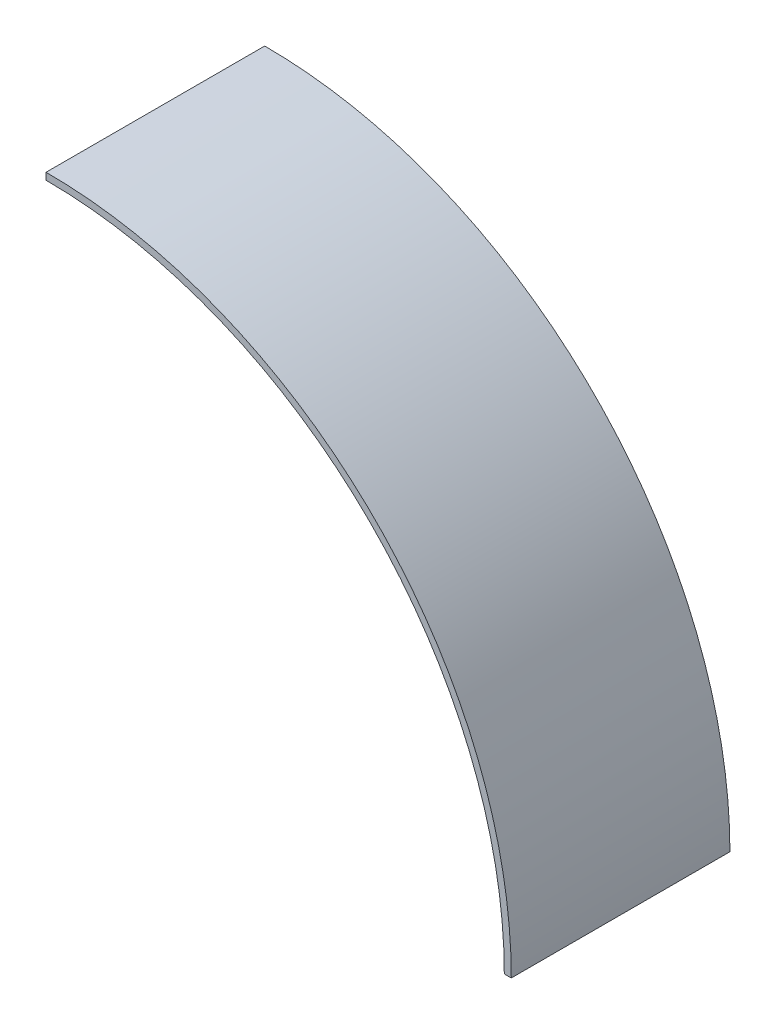
ISO-10303-21;
HEADER;
FILE_DESCRIPTION(('STEP AP214'),'2;1');
FILE_NAME('part.step','',(''),(''),'','','');
FILE_SCHEMA(('AUTOMOTIVE_DESIGN { 1 0 10303 214 1 1 1 1 }'));
ENDSEC;
DATA;
#1=APPLICATION_CONTEXT('core data for automotive mechanical design processes');
#2=APPLICATION_PROTOCOL_DEFINITION('international standard','automotive_design',2000,#1);
#3=PRODUCT_CONTEXT('',#1,'mechanical');
#4=PRODUCT('Part','Part','',(#3));
#5=PRODUCT_RELATED_PRODUCT_CATEGORY('part','',(#4));
#6=PRODUCT_DEFINITION_FORMATION('','',#4);
#7=PRODUCT_DEFINITION_CONTEXT('part definition',#1,'design');
#8=PRODUCT_DEFINITION('design','',#6,#7);
#9=PRODUCT_DEFINITION_SHAPE('','',#8);
#10=(LENGTH_UNIT() NAMED_UNIT(*) SI_UNIT(.MILLI.,.METRE.));
#11=(NAMED_UNIT(*) PLANE_ANGLE_UNIT() SI_UNIT($,.RADIAN.));
#12=(NAMED_UNIT(*) SI_UNIT($,.STERADIAN.) SOLID_ANGLE_UNIT());
#13=UNCERTAINTY_MEASURE_WITH_UNIT(LENGTH_MEASURE(1.E-05),#10,'distance_accuracy_value','');
#14=(GEOMETRIC_REPRESENTATION_CONTEXT(3) GLOBAL_UNCERTAINTY_ASSIGNED_CONTEXT((#13)) GLOBAL_UNIT_ASSIGNED_CONTEXT((#10,
#11,#12)) REPRESENTATION_CONTEXT('',''));
#15=CARTESIAN_POINT('',(0.,0.,0.));
#16=DIRECTION('',(0.,0.,1.));
#17=DIRECTION('',(1.,0.,0.));
#18=AXIS2_PLACEMENT_3D('',#15,#16,#17);
#19=CARTESIAN_POINT('',(365.,400.,25.0000000000001));
#20=DIRECTION('',(0.,1.,0.));
#21=DIRECTION('',(0.,0.,1.));
#22=AXIS2_PLACEMENT_3D('',#19,#20,#21);
#23=PLANE('',#22);
#24=DIRECTION('',(1.,0.,0.));
#25=VECTOR('',#24,1.);
#26=CARTESIAN_POINT('',(365.,400.,48.5));
#27=LINE('',#26,#25);
#28=CARTESIAN_POINT('',(364.25,400.,48.5));
#29=VERTEX_POINT('',#28);
#30=CARTESIAN_POINT('',(365.75,400.,48.5));
#31=VERTEX_POINT('',#30);
#32=EDGE_CURVE('E12',#29,#31,#27,.T.);
#33=ORIENTED_EDGE('',*,*,#32,.F.);
#34=DIRECTION('',(0.,0.,-1.));
#35=VECTOR('',#34,1.);
#36=CARTESIAN_POINT('',(364.25,400.,211.338996406885));
#37=LINE('',#36,#35);
#38=CARTESIAN_POINT('',(364.25,400.,1.50000000000019));
#39=VERTEX_POINT('',#38);
#40=EDGE_CURVE('E120',#39,#29,#37,.F.);
#41=ORIENTED_EDGE('',*,*,#40,.F.);
#42=DIRECTION('',(1.,0.,0.));
#43=VECTOR('',#42,1.);
#44=CARTESIAN_POINT('',(365.,400.,1.50000000000019));
#45=LINE('',#44,#43);
#46=CARTESIAN_POINT('',(365.75,400.,1.50000000000019));
#47=VERTEX_POINT('',#46);
#48=EDGE_CURVE('E66',#39,#47,#45,.T.);
#49=ORIENTED_EDGE('',*,*,#48,.T.);
#50=DIRECTION('',(0.,0.,-1.));
#51=VECTOR('',#50,1.);
#52=CARTESIAN_POINT('',(365.75,400.,211.338996406885));
#53=LINE('',#52,#51);
#54=EDGE_CURVE('E119',#47,#31,#53,.F.);
#55=ORIENTED_EDGE('',*,*,#54,.T.);
#56=EDGE_LOOP('',(#33,#41,#49,#55));
#57=FACE_BOUND('',#56,.T.);
#58=ADVANCED_FACE('F53',(#57),#23,.F.);
#59=CARTESIAN_POINT('',(265.75,400.,1.50000000000031));
#60=DIRECTION('',(0.,0.,1.));
#61=DIRECTION('',(1.,0.,0.));
#62=AXIS2_PLACEMENT_3D('',#59,#60,#61);
#63=PLANE('',#62);
#64=ORIENTED_EDGE('',*,*,#48,.F.);
#65=CARTESIAN_POINT('',(265.75,400.,1.50000000000042));
#66=DIRECTION('',(0.,0.,-1.));
#67=DIRECTION('',(-1.,0.,0.));
#68=AXIS2_PLACEMENT_3D('',#65,#66,#67);
#69=CIRCLE('',#68,98.5000000000001);
#70=CARTESIAN_POINT('',(265.75,498.5,1.5000000000003));
#71=VERTEX_POINT('',#70);
#72=EDGE_CURVE('E152',#71,#39,#69,.T.);
#73=ORIENTED_EDGE('',*,*,#72,.F.);
#74=DIRECTION('',(0.,1.,0.));
#75=VECTOR('',#74,1.);
#76=CARTESIAN_POINT('',(265.75,499.25,1.50000000000031));
#77=LINE('',#76,#75);
#78=CARTESIAN_POINT('',(265.75,500.,1.5000000000003));
#79=VERTEX_POINT('',#78);
#80=EDGE_CURVE('E112',#71,#79,#77,.T.);
#81=ORIENTED_EDGE('',*,*,#80,.T.);
#82=CARTESIAN_POINT('',(265.75,400.,1.50000000000042));
#83=DIRECTION('',(0.,0.,-1.));
#84=DIRECTION('',(-1.,0.,0.));
#85=AXIS2_PLACEMENT_3D('',#82,#83,#84);
#86=CIRCLE('',#85,100.);
#87=EDGE_CURVE('E128',#79,#47,#86,.T.);
#88=ORIENTED_EDGE('',*,*,#87,.T.);
#89=EDGE_LOOP('',(#64,#73,#81,#88));
#90=FACE_BOUND('',#89,.T.);
#91=ADVANCED_FACE('F132',(#90),#63,.F.);
#92=CARTESIAN_POINT('',(265.75,499.25,25.0000000000002));
#93=DIRECTION('',(1.,0.,0.));
#94=DIRECTION('',(0.,0.,-1.));
#95=AXIS2_PLACEMENT_3D('',#92,#93,#94);
#96=PLANE('',#95);
#97=ORIENTED_EDGE('',*,*,#80,.F.);
#98=DIRECTION('',(0.,0.,-1.));
#99=VECTOR('',#98,1.);
#100=CARTESIAN_POINT('',(265.75,498.5,211.338996406885));
#101=LINE('',#100,#99);
#102=CARTESIAN_POINT('',(265.75,498.5,48.5000000000001));
#103=VERTEX_POINT('',#102);
#104=EDGE_CURVE('E134',#103,#71,#101,.T.);
#105=ORIENTED_EDGE('',*,*,#104,.F.);
#106=DIRECTION('',(0.,1.,0.));
#107=VECTOR('',#106,1.);
#108=CARTESIAN_POINT('',(265.75,499.25,48.5000000000001));
#109=LINE('',#108,#107);
#110=CARTESIAN_POINT('',(265.75,500.,48.5000000000001));
#111=VERTEX_POINT('',#110);
#112=EDGE_CURVE('E58',#103,#111,#109,.T.);
#113=ORIENTED_EDGE('',*,*,#112,.T.);
#114=DIRECTION('',(0.,0.,-1.));
#115=VECTOR('',#114,1.);
#116=CARTESIAN_POINT('',(265.75,500.,211.338996406885));
#117=LINE('',#116,#115);
#118=EDGE_CURVE('E142',#111,#79,#117,.T.);
#119=ORIENTED_EDGE('',*,*,#118,.T.);
#120=EDGE_LOOP('',(#97,#105,#113,#119));
#121=FACE_BOUND('',#120,.T.);
#122=ADVANCED_FACE('F172',(#121),#96,.F.);
#123=CARTESIAN_POINT('',(265.75,400.,48.5000000000001));
#124=DIRECTION('',(0.,0.,-1.));
#125=DIRECTION('',(-1.,0.,0.));
#126=AXIS2_PLACEMENT_3D('',#123,#124,#125);
#127=PLANE('',#126);
#128=CARTESIAN_POINT('',(265.75,400.,48.5000000000001));
#129=DIRECTION('',(0.,0.,-1.));
#130=DIRECTION('',(-1.,0.,0.));
#131=AXIS2_PLACEMENT_3D('',#128,#129,#130);
#132=CIRCLE('',#131,98.5000000000001);
#133=EDGE_CURVE('E138',#29,#103,#132,.F.);
#134=ORIENTED_EDGE('',*,*,#133,.F.);
#135=ORIENTED_EDGE('',*,*,#32,.T.);
#136=CARTESIAN_POINT('',(265.75,400.,48.5000000000001));
#137=DIRECTION('',(0.,0.,-1.));
#138=DIRECTION('',(-1.,0.,0.));
#139=AXIS2_PLACEMENT_3D('',#136,#137,#138);
#140=CIRCLE('',#139,100.);
#141=EDGE_CURVE('E129',#31,#111,#140,.F.);
#142=ORIENTED_EDGE('',*,*,#141,.T.);
#143=ORIENTED_EDGE('',*,*,#112,.F.);
#144=EDGE_LOOP('',(#134,#135,#142,#143));
#145=FACE_BOUND('',#144,.T.);
#146=ADVANCED_FACE('F56',(#145),#127,.F.);
#147=CARTESIAN_POINT('',(265.75,400.,211.338996406885));
#148=DIRECTION('',(0.,0.,-1.));
#149=DIRECTION('',(-1.,0.,0.));
#150=AXIS2_PLACEMENT_3D('',#147,#148,#149);
#151=CYLINDRICAL_SURFACE('',#150,100.);
#152=ORIENTED_EDGE('',*,*,#118,.F.);
#153=ORIENTED_EDGE('',*,*,#141,.F.);
#154=ORIENTED_EDGE('',*,*,#54,.F.);
#155=ORIENTED_EDGE('',*,*,#87,.F.);
#156=EDGE_LOOP('',(#152,#153,#154,#155));
#157=FACE_BOUND('',#156,.T.);
#158=ADVANCED_FACE('F127',(#157),#151,.T.);
#159=CARTESIAN_POINT('',(265.75,400.,211.338996406885));
#160=DIRECTION('',(0.,0.,-1.));
#161=DIRECTION('',(-1.,0.,0.));
#162=AXIS2_PLACEMENT_3D('',#159,#160,#161);
#163=CYLINDRICAL_SURFACE('',#162,98.5000000000001);
#164=ORIENTED_EDGE('',*,*,#104,.T.);
#165=ORIENTED_EDGE('',*,*,#72,.T.);
#166=ORIENTED_EDGE('',*,*,#40,.T.);
#167=ORIENTED_EDGE('',*,*,#133,.T.);
#168=EDGE_LOOP('',(#164,#165,#166,#167));
#169=FACE_BOUND('',#168,.T.);
#170=ADVANCED_FACE('F170',(#169),#163,.F.);
#171=CLOSED_SHELL('',(#58,#91,#122,#146,#158,#170));
#172=MANIFOLD_SOLID_BREP('B2',#171);
#173=ADVANCED_BREP_SHAPE_REPRESENTATION('',(#18,#172),#14);
#174=SHAPE_DEFINITION_REPRESENTATION(#9,#173);
ENDSEC;
END-ISO-10303-21;
